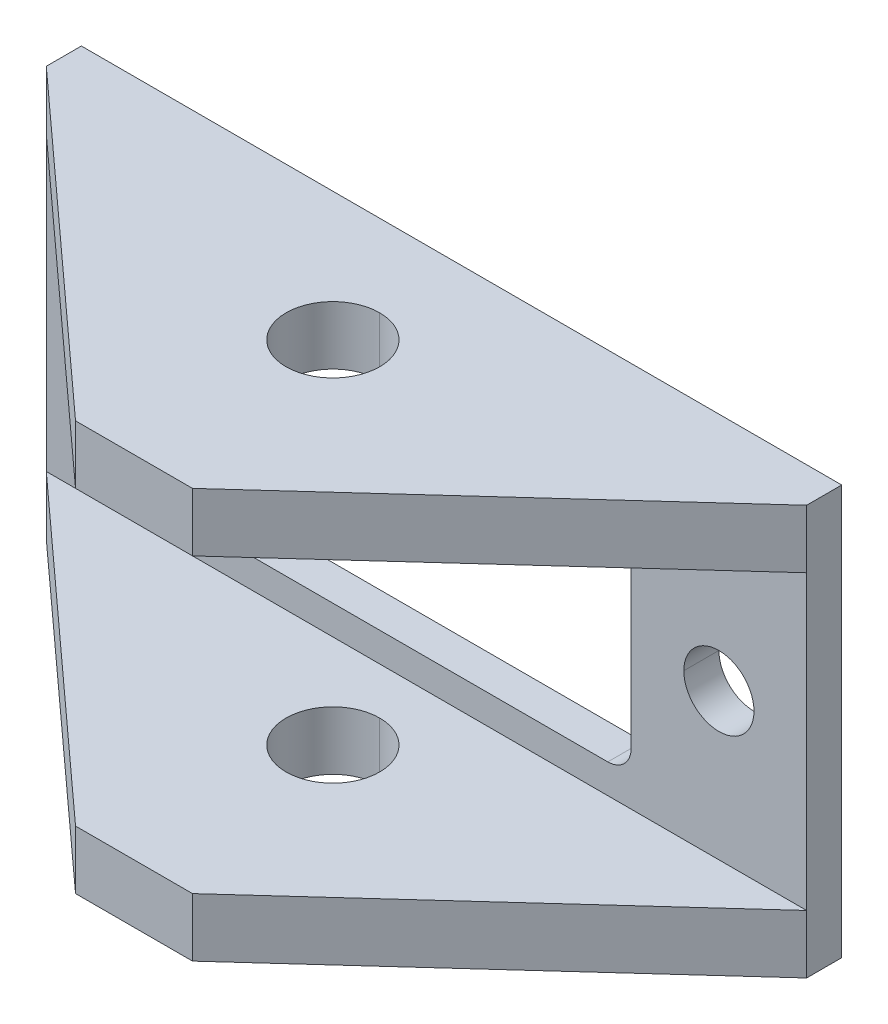
ISO-10303-21;
HEADER;
FILE_DESCRIPTION(('STEP AP214'),'2;1');
FILE_NAME('part.step','',(''),(''),'','','');
FILE_SCHEMA(('AUTOMOTIVE_DESIGN { 1 0 10303 214 1 1 1 1 }'));
ENDSEC;
DATA;
#1=APPLICATION_CONTEXT('core data for automotive mechanical design processes');
#2=APPLICATION_PROTOCOL_DEFINITION('international standard','automotive_design',2000,#1);
#3=PRODUCT_CONTEXT('',#1,'mechanical');
#4=PRODUCT('Part','Part','',(#3));
#5=PRODUCT_RELATED_PRODUCT_CATEGORY('part','',(#4));
#6=PRODUCT_DEFINITION_FORMATION('','',#4);
#7=PRODUCT_DEFINITION_CONTEXT('part definition',#1,'design');
#8=PRODUCT_DEFINITION('design','',#6,#7);
#9=PRODUCT_DEFINITION_SHAPE('','',#8);
#10=(LENGTH_UNIT() NAMED_UNIT(*) SI_UNIT(.MILLI.,.METRE.));
#11=(NAMED_UNIT(*) PLANE_ANGLE_UNIT() SI_UNIT($,.RADIAN.));
#12=(NAMED_UNIT(*) SI_UNIT($,.STERADIAN.) SOLID_ANGLE_UNIT());
#13=UNCERTAINTY_MEASURE_WITH_UNIT(LENGTH_MEASURE(1.E-05),#10,'distance_accuracy_value','');
#14=(GEOMETRIC_REPRESENTATION_CONTEXT(3) GLOBAL_UNCERTAINTY_ASSIGNED_CONTEXT((#13)) GLOBAL_UNIT_ASSIGNED_CONTEXT((#10,
#11,#12)) REPRESENTATION_CONTEXT('',''));
#15=CARTESIAN_POINT('',(0.,0.,0.));
#16=DIRECTION('',(0.,0.,1.));
#17=DIRECTION('',(1.,0.,0.));
#18=AXIS2_PLACEMENT_3D('',#15,#16,#17);
#19=CARTESIAN_POINT('',(0.,0.,-1.5));
#20=DIRECTION('',(0.,1.,0.));
#21=DIRECTION('',(0.,0.,1.));
#22=AXIS2_PLACEMENT_3D('',#19,#20,#21);
#23=CYLINDRICAL_SURFACE('',#22,4.);
#24=DIRECTION('',(0.,1.,0.));
#25=VECTOR('',#24,1.);
#26=CARTESIAN_POINT('',(0.,0.,-5.5));
#27=LINE('',#26,#25);
#28=CARTESIAN_POINT('',(0.,0.,-5.5));
#29=VERTEX_POINT('',#28);
#30=CARTESIAN_POINT('',(0.,5.,-5.5));
#31=VERTEX_POINT('',#30);
#32=EDGE_CURVE('E396',#29,#31,#27,.T.);
#33=ORIENTED_EDGE('',*,*,#32,.F.);
#34=CARTESIAN_POINT('',(0.,0.,-1.5));
#35=DIRECTION('',(0.,1.,0.));
#36=DIRECTION('',(0.,0.,1.));
#37=AXIS2_PLACEMENT_3D('',#34,#35,#36);
#38=CIRCLE('',#37,4.);
#39=CARTESIAN_POINT('',(0.,0.,2.5));
#40=VERTEX_POINT('',#39);
#41=EDGE_CURVE('E353',#40,#29,#38,.T.);
#42=ORIENTED_EDGE('',*,*,#41,.F.);
#43=DIRECTION('',(0.,1.,0.));
#44=VECTOR('',#43,1.);
#45=CARTESIAN_POINT('',(0.,0.,2.5));
#46=LINE('',#45,#44);
#47=CARTESIAN_POINT('',(0.,5.,2.5));
#48=VERTEX_POINT('',#47);
#49=EDGE_CURVE('E280',#40,#48,#46,.T.);
#50=ORIENTED_EDGE('',*,*,#49,.T.);
#51=CARTESIAN_POINT('',(0.,5.,-1.5));
#52=DIRECTION('',(0.,-1.,0.));
#53=DIRECTION('',(0.,0.,-1.));
#54=AXIS2_PLACEMENT_3D('',#51,#52,#53);
#55=CIRCLE('',#54,4.);
#56=EDGE_CURVE('E356',#31,#48,#55,.T.);
#57=ORIENTED_EDGE('',*,*,#56,.F.);
#58=EDGE_LOOP('',(#33,#42,#50,#57));
#59=FACE_BOUND('',#58,.T.);
#60=ADVANCED_FACE('F16',(#59),#23,.F.);
#61=CARTESIAN_POINT('',(0.,0.,-1.5));
#62=DIRECTION('',(0.,1.,0.));
#63=DIRECTION('',(0.,0.,1.));
#64=AXIS2_PLACEMENT_3D('',#61,#62,#63);
#65=CYLINDRICAL_SURFACE('',#64,4.);
#66=DIRECTION('',(0.,1.,0.));
#67=VECTOR('',#66,1.);
#68=CARTESIAN_POINT('',(0.,0.,-5.5));
#69=LINE('',#68,#67);
#70=CARTESIAN_POINT('',(0.,30.,-5.5));
#71=VERTEX_POINT('',#70);
#72=CARTESIAN_POINT('',(0.,35.,-5.5));
#73=VERTEX_POINT('',#72);
#74=EDGE_CURVE('E279',#71,#73,#69,.T.);
#75=ORIENTED_EDGE('',*,*,#74,.F.);
#76=CARTESIAN_POINT('',(0.,30.,-1.5));
#77=DIRECTION('',(0.,-1.,0.));
#78=DIRECTION('',(0.,0.,-1.));
#79=AXIS2_PLACEMENT_3D('',#76,#77,#78);
#80=CIRCLE('',#79,4.);
#81=CARTESIAN_POINT('',(0.,30.,2.5));
#82=VERTEX_POINT('',#81);
#83=EDGE_CURVE('E416',#71,#82,#80,.T.);
#84=ORIENTED_EDGE('',*,*,#83,.T.);
#85=DIRECTION('',(0.,1.,0.));
#86=VECTOR('',#85,1.);
#87=CARTESIAN_POINT('',(0.,0.,2.5));
#88=LINE('',#87,#86);
#89=CARTESIAN_POINT('',(0.,35.,2.5));
#90=VERTEX_POINT('',#89);
#91=EDGE_CURVE('E448',#82,#90,#88,.T.);
#92=ORIENTED_EDGE('',*,*,#91,.T.);
#93=CARTESIAN_POINT('',(0.,35.,-1.5));
#94=DIRECTION('',(0.,1.,0.));
#95=DIRECTION('',(0.,0.,1.));
#96=AXIS2_PLACEMENT_3D('',#93,#94,#95);
#97=CIRCLE('',#96,4.);
#98=EDGE_CURVE('E357',#90,#73,#97,.T.);
#99=ORIENTED_EDGE('',*,*,#98,.T.);
#100=EDGE_LOOP('',(#75,#84,#92,#99));
#101=FACE_BOUND('',#100,.T.);
#102=ADVANCED_FACE('F607',(#101),#65,.F.);
#103=CARTESIAN_POINT('',(15.5,9.5,-12.5));
#104=DIRECTION('',(0.,0.,1.));
#105=DIRECTION('',(1.,0.,0.));
#106=AXIS2_PLACEMENT_3D('',#103,#104,#105);
#107=CYLINDRICAL_SURFACE('',#106,2.);
#108=CARTESIAN_POINT('',(15.5,9.5,-12.5));
#109=DIRECTION('',(0.,0.,1.));
#110=DIRECTION('',(-1.,0.,0.));
#111=AXIS2_PLACEMENT_3D('',#108,#109,#110);
#112=CIRCLE('',#111,2.);
#113=CARTESIAN_POINT('',(15.5,7.5,-12.5));
#114=VERTEX_POINT('',#113);
#115=CARTESIAN_POINT('',(17.5,9.5,-12.5));
#116=VERTEX_POINT('',#115);
#117=EDGE_CURVE('E291',#114,#116,#112,.T.);
#118=ORIENTED_EDGE('',*,*,#117,.F.);
#119=DIRECTION('',(0.,0.,-1.));
#120=VECTOR('',#119,1.);
#121=CARTESIAN_POINT('',(15.5,7.5,-12.5));
#122=LINE('',#121,#120);
#123=CARTESIAN_POINT('',(15.5,7.5,-9.5));
#124=VERTEX_POINT('',#123);
#125=EDGE_CURVE('E391',#124,#114,#122,.T.);
#126=ORIENTED_EDGE('',*,*,#125,.F.);
#127=CARTESIAN_POINT('',(15.5,9.5,-9.5));
#128=DIRECTION('',(0.,0.,-1.));
#129=DIRECTION('',(1.,0.,0.));
#130=AXIS2_PLACEMENT_3D('',#127,#128,#129);
#131=CIRCLE('',#130,2.);
#132=CARTESIAN_POINT('',(17.5,9.5,-9.5));
#133=VERTEX_POINT('',#132);
#134=EDGE_CURVE('E397',#133,#124,#131,.T.);
#135=ORIENTED_EDGE('',*,*,#134,.F.);
#136=DIRECTION('',(0.,0.,1.));
#137=VECTOR('',#136,1.);
#138=CARTESIAN_POINT('',(17.5,9.5,-12.5));
#139=LINE('',#138,#137);
#140=EDGE_CURVE('E198',#116,#133,#139,.T.);
#141=ORIENTED_EDGE('',*,*,#140,.F.);
#142=EDGE_LOOP('',(#118,#126,#135,#141));
#143=FACE_BOUND('',#142,.T.);
#144=ADVANCED_FACE('F685',(#143),#107,.F.);
#145=CARTESIAN_POINT('',(-15.5,9.5,-12.5));
#146=DIRECTION('',(0.,0.,-1.));
#147=DIRECTION('',(-1.,0.,0.));
#148=AXIS2_PLACEMENT_3D('',#145,#146,#147);
#149=CYLINDRICAL_SURFACE('',#148,2.);
#150=CARTESIAN_POINT('',(-15.5,9.5,-12.5));
#151=DIRECTION('',(0.,0.,1.));
#152=DIRECTION('',(-1.,0.,0.));
#153=AXIS2_PLACEMENT_3D('',#150,#151,#152);
#154=CIRCLE('',#153,2.);
#155=CARTESIAN_POINT('',(-17.5,9.5,-12.5));
#156=VERTEX_POINT('',#155);
#157=CARTESIAN_POINT('',(-15.5,7.5,-12.5));
#158=VERTEX_POINT('',#157);
#159=EDGE_CURVE('E292',#156,#158,#154,.T.);
#160=ORIENTED_EDGE('',*,*,#159,.F.);
#161=DIRECTION('',(0.,0.,-1.));
#162=VECTOR('',#161,1.);
#163=CARTESIAN_POINT('',(-17.5,9.5,-12.5));
#164=LINE('',#163,#162);
#165=CARTESIAN_POINT('',(-17.5,9.5,-9.5));
#166=VERTEX_POINT('',#165);
#167=EDGE_CURVE('E427',#166,#156,#164,.T.);
#168=ORIENTED_EDGE('',*,*,#167,.F.);
#169=CARTESIAN_POINT('',(-15.5,9.5,-9.5));
#170=DIRECTION('',(0.,0.,-1.));
#171=DIRECTION('',(1.,0.,0.));
#172=AXIS2_PLACEMENT_3D('',#169,#170,#171);
#173=CIRCLE('',#172,2.);
#174=CARTESIAN_POINT('',(-15.5,7.5,-9.5));
#175=VERTEX_POINT('',#174);
#176=EDGE_CURVE('E244',#175,#166,#173,.T.);
#177=ORIENTED_EDGE('',*,*,#176,.F.);
#178=DIRECTION('',(0.,0.,1.));
#179=VECTOR('',#178,1.);
#180=CARTESIAN_POINT('',(-15.5,7.5,-9.5));
#181=LINE('',#180,#179);
#182=EDGE_CURVE('E382',#158,#175,#181,.T.);
#183=ORIENTED_EDGE('',*,*,#182,.F.);
#184=EDGE_LOOP('',(#160,#168,#177,#183));
#185=FACE_BOUND('',#184,.T.);
#186=ADVANCED_FACE('F679',(#185),#149,.F.);
#187=CARTESIAN_POINT('',(-15.5,25.5,-12.5));
#188=DIRECTION('',(0.,0.,1.));
#189=DIRECTION('',(1.,0.,0.));
#190=AXIS2_PLACEMENT_3D('',#187,#188,#189);
#191=CYLINDRICAL_SURFACE('',#190,2.);
#192=CARTESIAN_POINT('',(-15.5,25.5,-12.5));
#193=DIRECTION('',(0.,0.,1.));
#194=DIRECTION('',(-1.,0.,0.));
#195=AXIS2_PLACEMENT_3D('',#192,#193,#194);
#196=CIRCLE('',#195,2.);
#197=CARTESIAN_POINT('',(-15.5,27.5,-12.5));
#198=VERTEX_POINT('',#197);
#199=CARTESIAN_POINT('',(-17.5,25.5,-12.5));
#200=VERTEX_POINT('',#199);
#201=EDGE_CURVE('E261',#198,#200,#196,.T.);
#202=ORIENTED_EDGE('',*,*,#201,.F.);
#203=DIRECTION('',(0.,0.,-1.));
#204=VECTOR('',#203,1.);
#205=CARTESIAN_POINT('',(-15.5,27.5,-12.5));
#206=LINE('',#205,#204);
#207=CARTESIAN_POINT('',(-15.5,27.5,-9.5));
#208=VERTEX_POINT('',#207);
#209=EDGE_CURVE('E11',#208,#198,#206,.T.);
#210=ORIENTED_EDGE('',*,*,#209,.F.);
#211=CARTESIAN_POINT('',(-15.5,25.5,-9.5));
#212=DIRECTION('',(0.,0.,-1.));
#213=DIRECTION('',(1.,0.,0.));
#214=AXIS2_PLACEMENT_3D('',#211,#212,#213);
#215=CIRCLE('',#214,2.);
#216=CARTESIAN_POINT('',(-17.5,25.5,-9.5));
#217=VERTEX_POINT('',#216);
#218=EDGE_CURVE('E318',#217,#208,#215,.T.);
#219=ORIENTED_EDGE('',*,*,#218,.F.);
#220=DIRECTION('',(0.,0.,1.));
#221=VECTOR('',#220,1.);
#222=CARTESIAN_POINT('',(-17.5,25.5,-12.5));
#223=LINE('',#222,#221);
#224=EDGE_CURVE('E430',#200,#217,#223,.T.);
#225=ORIENTED_EDGE('',*,*,#224,.F.);
#226=EDGE_LOOP('',(#202,#210,#219,#225));
#227=FACE_BOUND('',#226,.T.);
#228=ADVANCED_FACE('F18',(#227),#191,.F.);
#229=CARTESIAN_POINT('',(15.5,25.5,-12.5));
#230=DIRECTION('',(0.,0.,-1.));
#231=DIRECTION('',(-1.,0.,0.));
#232=AXIS2_PLACEMENT_3D('',#229,#230,#231);
#233=CYLINDRICAL_SURFACE('',#232,2.);
#234=CARTESIAN_POINT('',(15.5,25.5,-12.5));
#235=DIRECTION('',(0.,0.,1.));
#236=DIRECTION('',(-1.,0.,0.));
#237=AXIS2_PLACEMENT_3D('',#234,#235,#236);
#238=CIRCLE('',#237,2.);
#239=CARTESIAN_POINT('',(17.5,25.5,-12.5));
#240=VERTEX_POINT('',#239);
#241=CARTESIAN_POINT('',(15.5,27.5,-12.5));
#242=VERTEX_POINT('',#241);
#243=EDGE_CURVE('E262',#240,#242,#238,.T.);
#244=ORIENTED_EDGE('',*,*,#243,.F.);
#245=DIRECTION('',(0.,0.,-1.));
#246=VECTOR('',#245,1.);
#247=CARTESIAN_POINT('',(17.5,25.5,-12.5));
#248=LINE('',#247,#246);
#249=CARTESIAN_POINT('',(17.5,25.5,-9.5));
#250=VERTEX_POINT('',#249);
#251=EDGE_CURVE('E187',#250,#240,#248,.T.);
#252=ORIENTED_EDGE('',*,*,#251,.F.);
#253=CARTESIAN_POINT('',(15.5,25.5,-9.5));
#254=DIRECTION('',(0.,0.,-1.));
#255=DIRECTION('',(1.,0.,0.));
#256=AXIS2_PLACEMENT_3D('',#253,#254,#255);
#257=CIRCLE('',#256,2.);
#258=CARTESIAN_POINT('',(15.5,27.5,-9.5));
#259=VERTEX_POINT('',#258);
#260=EDGE_CURVE('E343',#259,#250,#257,.T.);
#261=ORIENTED_EDGE('',*,*,#260,.F.);
#262=DIRECTION('',(0.,0.,1.));
#263=VECTOR('',#262,1.);
#264=CARTESIAN_POINT('',(15.5,27.5,-9.5));
#265=LINE('',#264,#263);
#266=EDGE_CURVE('E27',#242,#259,#265,.T.);
#267=ORIENTED_EDGE('',*,*,#266,.F.);
#268=EDGE_LOOP('',(#244,#252,#261,#267));
#269=FACE_BOUND('',#268,.T.);
#270=ADVANCED_FACE('F656',(#269),#233,.F.);
#271=CARTESIAN_POINT('',(-25.,17.5,-12.5));
#272=DIRECTION('',(0.,0.,1.));
#273=DIRECTION('',(1.,0.,0.));
#274=AXIS2_PLACEMENT_3D('',#271,#272,#273);
#275=CYLINDRICAL_SURFACE('',#274,3.);
#276=DIRECTION('',(0.,0.,1.));
#277=VECTOR('',#276,1.);
#278=CARTESIAN_POINT('',(-28.,17.5,-12.5));
#279=LINE('',#278,#277);
#280=CARTESIAN_POINT('',(-28.,17.5,-12.5));
#281=VERTEX_POINT('',#280);
#282=CARTESIAN_POINT('',(-28.,17.5,-9.5));
#283=VERTEX_POINT('',#282);
#284=EDGE_CURVE('E263',#281,#283,#279,.T.);
#285=ORIENTED_EDGE('',*,*,#284,.F.);
#286=CARTESIAN_POINT('',(-25.,17.5,-12.5));
#287=DIRECTION('',(0.,0.,1.));
#288=DIRECTION('',(1.,0.,0.));
#289=AXIS2_PLACEMENT_3D('',#286,#287,#288);
#290=CIRCLE('',#289,3.);
#291=CARTESIAN_POINT('',(-22.,17.5,-12.5));
#292=VERTEX_POINT('',#291);
#293=EDGE_CURVE('E300',#292,#281,#290,.T.);
#294=ORIENTED_EDGE('',*,*,#293,.F.);
#295=DIRECTION('',(0.,0.,1.));
#296=VECTOR('',#295,1.);
#297=CARTESIAN_POINT('',(-22.,17.5,-12.5));
#298=LINE('',#297,#296);
#299=CARTESIAN_POINT('',(-22.,17.5,-9.5));
#300=VERTEX_POINT('',#299);
#301=EDGE_CURVE('E297',#292,#300,#298,.T.);
#302=ORIENTED_EDGE('',*,*,#301,.T.);
#303=CARTESIAN_POINT('',(-25.,17.5,-9.5));
#304=DIRECTION('',(0.,0.,1.));
#305=DIRECTION('',(1.,0.,0.));
#306=AXIS2_PLACEMENT_3D('',#303,#304,#305);
#307=CIRCLE('',#306,3.);
#308=EDGE_CURVE('E331',#300,#283,#307,.T.);
#309=ORIENTED_EDGE('',*,*,#308,.T.);
#310=EDGE_LOOP('',(#285,#294,#302,#309));
#311=FACE_BOUND('',#310,.T.);
#312=ADVANCED_FACE('F757',(#311),#275,.F.);
#313=CARTESIAN_POINT('',(25.,17.5,-12.5));
#314=DIRECTION('',(0.,0.,1.));
#315=DIRECTION('',(1.,0.,0.));
#316=AXIS2_PLACEMENT_3D('',#313,#314,#315);
#317=CYLINDRICAL_SURFACE('',#316,3.);
#318=DIRECTION('',(0.,0.,1.));
#319=VECTOR('',#318,1.);
#320=CARTESIAN_POINT('',(22.,17.5,-12.5));
#321=LINE('',#320,#319);
#322=CARTESIAN_POINT('',(22.,17.5,-12.5));
#323=VERTEX_POINT('',#322);
#324=CARTESIAN_POINT('',(22.,17.5,-9.5));
#325=VERTEX_POINT('',#324);
#326=EDGE_CURVE('E274',#323,#325,#321,.T.);
#327=ORIENTED_EDGE('',*,*,#326,.F.);
#328=CARTESIAN_POINT('',(25.,17.5,-12.5));
#329=DIRECTION('',(0.,0.,1.));
#330=DIRECTION('',(1.,0.,0.));
#331=AXIS2_PLACEMENT_3D('',#328,#329,#330);
#332=CIRCLE('',#331,3.);
#333=CARTESIAN_POINT('',(28.,17.5,-12.5));
#334=VERTEX_POINT('',#333);
#335=EDGE_CURVE('E303',#334,#323,#332,.T.);
#336=ORIENTED_EDGE('',*,*,#335,.F.);
#337=DIRECTION('',(0.,0.,1.));
#338=VECTOR('',#337,1.);
#339=CARTESIAN_POINT('',(28.,17.5,-12.5));
#340=LINE('',#339,#338);
#341=CARTESIAN_POINT('',(28.,17.5,-9.5));
#342=VERTEX_POINT('',#341);
#343=EDGE_CURVE('E273',#334,#342,#340,.T.);
#344=ORIENTED_EDGE('',*,*,#343,.T.);
#345=CARTESIAN_POINT('',(25.,17.5,-9.5));
#346=DIRECTION('',(0.,0.,1.));
#347=DIRECTION('',(1.,0.,0.));
#348=AXIS2_PLACEMENT_3D('',#345,#346,#347);
#349=CIRCLE('',#348,3.);
#350=EDGE_CURVE('E20',#342,#325,#349,.T.);
#351=ORIENTED_EDGE('',*,*,#350,.T.);
#352=EDGE_LOOP('',(#327,#336,#344,#351));
#353=FACE_BOUND('',#352,.T.);
#354=ADVANCED_FACE('F713',(#353),#317,.F.);
#355=CARTESIAN_POINT('',(0.,27.5,-12.5));
#356=DIRECTION('',(0.,-1.,0.));
#357=DIRECTION('',(0.,0.,-1.));
#358=AXIS2_PLACEMENT_3D('',#355,#356,#357);
#359=PLANE('',#358);
#360=DIRECTION('',(1.,0.,0.));
#361=VECTOR('',#360,1.);
#362=CARTESIAN_POINT('',(0.,27.5,-12.5));
#363=LINE('',#362,#361);
#364=EDGE_CURVE('E258',#198,#242,#363,.T.);
#365=ORIENTED_EDGE('',*,*,#364,.T.);
#366=ORIENTED_EDGE('',*,*,#266,.T.);
#367=DIRECTION('',(1.,0.,0.));
#368=VECTOR('',#367,1.);
#369=CARTESIAN_POINT('',(0.,27.5,-9.5));
#370=LINE('',#369,#368);
#371=EDGE_CURVE('E348',#208,#259,#370,.T.);
#372=ORIENTED_EDGE('',*,*,#371,.F.);
#373=ORIENTED_EDGE('',*,*,#209,.T.);
#374=EDGE_LOOP('',(#365,#366,#372,#373));
#375=FACE_BOUND('',#374,.T.);
#376=ADVANCED_FACE('F661',(#375),#359,.T.);
#377=CARTESIAN_POINT('',(-17.5,0.,-12.5));
#378=DIRECTION('',(-1.,0.,0.));
#379=DIRECTION('',(0.,1.,0.));
#380=AXIS2_PLACEMENT_3D('',#377,#378,#379);
#381=PLANE('',#380);
#382=DIRECTION('',(0.,-1.,0.));
#383=VECTOR('',#382,1.);
#384=CARTESIAN_POINT('',(-17.5,0.,-12.5));
#385=LINE('',#384,#383);
#386=EDGE_CURVE('E327',#200,#156,#385,.T.);
#387=ORIENTED_EDGE('',*,*,#386,.F.);
#388=ORIENTED_EDGE('',*,*,#224,.T.);
#389=DIRECTION('',(0.,-1.,0.));
#390=VECTOR('',#389,1.);
#391=CARTESIAN_POINT('',(-17.5,0.,-9.5));
#392=LINE('',#391,#390);
#393=EDGE_CURVE('E314',#217,#166,#392,.T.);
#394=ORIENTED_EDGE('',*,*,#393,.T.);
#395=ORIENTED_EDGE('',*,*,#167,.T.);
#396=EDGE_LOOP('',(#387,#388,#394,#395));
#397=FACE_BOUND('',#396,.T.);
#398=ADVANCED_FACE('F675',(#397),#381,.F.);
#399=CARTESIAN_POINT('',(0.,7.5,-12.5));
#400=DIRECTION('',(0.,-1.,0.));
#401=DIRECTION('',(0.,0.,-1.));
#402=AXIS2_PLACEMENT_3D('',#399,#400,#401);
#403=PLANE('',#402);
#404=DIRECTION('',(1.,0.,0.));
#405=VECTOR('',#404,1.);
#406=CARTESIAN_POINT('',(0.,7.5,-12.5));
#407=LINE('',#406,#405);
#408=EDGE_CURVE('E287',#158,#114,#407,.T.);
#409=ORIENTED_EDGE('',*,*,#408,.F.);
#410=ORIENTED_EDGE('',*,*,#182,.T.);
#411=DIRECTION('',(1.,0.,0.));
#412=VECTOR('',#411,1.);
#413=CARTESIAN_POINT('',(0.,7.5,-9.5));
#414=LINE('',#413,#412);
#415=EDGE_CURVE('E252',#175,#124,#414,.T.);
#416=ORIENTED_EDGE('',*,*,#415,.T.);
#417=ORIENTED_EDGE('',*,*,#125,.T.);
#418=EDGE_LOOP('',(#409,#410,#416,#417));
#419=FACE_BOUND('',#418,.T.);
#420=ADVANCED_FACE('F682',(#419),#403,.F.);
#421=CARTESIAN_POINT('',(17.5,0.,-12.5));
#422=DIRECTION('',(-1.,0.,0.));
#423=DIRECTION('',(0.,1.,0.));
#424=AXIS2_PLACEMENT_3D('',#421,#422,#423);
#425=PLANE('',#424);
#426=DIRECTION('',(0.,-1.,0.));
#427=VECTOR('',#426,1.);
#428=CARTESIAN_POINT('',(17.5,0.,-9.5));
#429=LINE('',#428,#427);
#430=EDGE_CURVE('E347',#250,#133,#429,.T.);
#431=ORIENTED_EDGE('',*,*,#430,.F.);
#432=ORIENTED_EDGE('',*,*,#251,.T.);
#433=DIRECTION('',(0.,-1.,0.));
#434=VECTOR('',#433,1.);
#435=CARTESIAN_POINT('',(17.5,0.,-12.5));
#436=LINE('',#435,#434);
#437=EDGE_CURVE('E342',#240,#116,#436,.T.);
#438=ORIENTED_EDGE('',*,*,#437,.T.);
#439=ORIENTED_EDGE('',*,*,#140,.T.);
#440=EDGE_LOOP('',(#431,#432,#438,#439));
#441=FACE_BOUND('',#440,.T.);
#442=ADVANCED_FACE('F667',(#441),#425,.T.);
#443=CARTESIAN_POINT('',(0.,30.,-9.5));
#444=DIRECTION('',(0.,-1.,0.));
#445=DIRECTION('',(0.,0.,-1.));
#446=AXIS2_PLACEMENT_3D('',#443,#444,#445);
#447=PLANE('',#446);
#448=CARTESIAN_POINT('',(0.,30.,-1.5));
#449=DIRECTION('',(0.,-1.,0.));
#450=DIRECTION('',(0.,0.,-1.));
#451=AXIS2_PLACEMENT_3D('',#448,#449,#450);
#452=CIRCLE('',#451,4.);
#453=EDGE_CURVE('E275',#82,#71,#452,.T.);
#454=ORIENTED_EDGE('',*,*,#453,.F.);
#455=ORIENTED_EDGE('',*,*,#83,.F.);
#456=EDGE_LOOP('',(#454,#455));
#457=FACE_BOUND('',#456,.T.);
#458=DIRECTION('',(-0.739940073395944,0.,-0.672672793996312));
#459=VECTOR('',#458,1.);
#460=CARTESIAN_POINT('',(-9.97737556561086,30.,10.9751131221719));
#461=LINE('',#460,#459);
#462=CARTESIAN_POINT('',(-5.,30.,15.5));
#463=VERTEX_POINT('',#462);
#464=CARTESIAN_POINT('',(-32.5,30.,-9.5));
#465=VERTEX_POINT('',#464);
#466=EDGE_CURVE('E218',#463,#465,#461,.T.);
#467=ORIENTED_EDGE('',*,*,#466,.T.);
#468=DIRECTION('',(1.,0.,0.));
#469=VECTOR('',#468,1.);
#470=CARTESIAN_POINT('',(0.,30.,-9.5));
#471=LINE('',#470,#469);
#472=CARTESIAN_POINT('',(32.5,30.,-9.5));
#473=VERTEX_POINT('',#472);
#474=EDGE_CURVE('E420',#465,#473,#471,.T.);
#475=ORIENTED_EDGE('',*,*,#474,.T.);
#476=DIRECTION('',(-0.739940073395944,0.,0.672672793996312));
#477=VECTOR('',#476,1.);
#478=CARTESIAN_POINT('',(9.97737556561086,30.,10.9751131221719));
#479=LINE('',#478,#477);
#480=CARTESIAN_POINT('',(5.,30.,15.5));
#481=VERTEX_POINT('',#480);
#482=EDGE_CURVE('E221',#473,#481,#479,.T.);
#483=ORIENTED_EDGE('',*,*,#482,.T.);
#484=DIRECTION('',(-1.,0.,0.));
#485=VECTOR('',#484,1.);
#486=CARTESIAN_POINT('',(0.,30.,15.5));
#487=LINE('',#486,#485);
#488=EDGE_CURVE('E212',#481,#463,#487,.T.);
#489=ORIENTED_EDGE('',*,*,#488,.T.);
#490=EDGE_LOOP('',(#467,#475,#483,#489));
#491=FACE_BOUND('',#490,.T.);
#492=ADVANCED_FACE('F214',(#457,#491),#447,.T.);
#493=CARTESIAN_POINT('',(0.,5.,-9.5));
#494=DIRECTION('',(0.,-1.,0.));
#495=DIRECTION('',(0.,0.,-1.));
#496=AXIS2_PLACEMENT_3D('',#493,#494,#495);
#497=PLANE('',#496);
#498=CARTESIAN_POINT('',(0.,5.,-1.5));
#499=DIRECTION('',(0.,-1.,0.));
#500=DIRECTION('',(0.,0.,-1.));
#501=AXIS2_PLACEMENT_3D('',#498,#499,#500);
#502=CIRCLE('',#501,4.);
#503=EDGE_CURVE('E401',#48,#31,#502,.T.);
#504=ORIENTED_EDGE('',*,*,#503,.T.);
#505=ORIENTED_EDGE('',*,*,#56,.T.);
#506=EDGE_LOOP('',(#504,#505));
#507=FACE_BOUND('',#506,.T.);
#508=DIRECTION('',(-1.,0.,0.));
#509=VECTOR('',#508,1.);
#510=CARTESIAN_POINT('',(0.,5.,15.5));
#511=LINE('',#510,#509);
#512=CARTESIAN_POINT('',(5.,5.,15.5));
#513=VERTEX_POINT('',#512);
#514=CARTESIAN_POINT('',(-5.,5.,15.5));
#515=VERTEX_POINT('',#514);
#516=EDGE_CURVE('E362',#513,#515,#511,.T.);
#517=ORIENTED_EDGE('',*,*,#516,.F.);
#518=DIRECTION('',(-0.739940073395944,0.,0.672672793996312));
#519=VECTOR('',#518,1.);
#520=CARTESIAN_POINT('',(9.97737556561086,5.,10.9751131221719));
#521=LINE('',#520,#519);
#522=CARTESIAN_POINT('',(32.5,5.,-9.5));
#523=VERTEX_POINT('',#522);
#524=EDGE_CURVE('E387',#523,#513,#521,.T.);
#525=ORIENTED_EDGE('',*,*,#524,.F.);
#526=DIRECTION('',(1.,0.,0.));
#527=VECTOR('',#526,1.);
#528=CARTESIAN_POINT('',(0.,5.,-9.5));
#529=LINE('',#528,#527);
#530=CARTESIAN_POINT('',(-32.5,5.,-9.5));
#531=VERTEX_POINT('',#530);
#532=EDGE_CURVE('E335',#531,#523,#529,.T.);
#533=ORIENTED_EDGE('',*,*,#532,.F.);
#534=DIRECTION('',(-0.739940073395944,0.,-0.672672793996312));
#535=VECTOR('',#534,1.);
#536=CARTESIAN_POINT('',(-9.97737556561086,5.,10.9751131221719));
#537=LINE('',#536,#535);
#538=EDGE_CURVE('E324',#515,#531,#537,.T.);
#539=ORIENTED_EDGE('',*,*,#538,.F.);
#540=EDGE_LOOP('',(#517,#525,#533,#539));
#541=FACE_BOUND('',#540,.T.);
#542=ADVANCED_FACE('F494',(#507,#541),#497,.F.);
#543=CARTESIAN_POINT('',(0.,0.,0.));
#544=DIRECTION('',(0.,1.,0.));
#545=DIRECTION('',(1.,0.,0.));
#546=AXIS2_PLACEMENT_3D('',#543,#544,#545);
#547=PLANE('',#546);
#548=ORIENTED_EDGE('',*,*,#41,.T.);
#549=CARTESIAN_POINT('',(0.,0.,-1.5));
#550=DIRECTION('',(0.,1.,0.));
#551=DIRECTION('',(0.,0.,1.));
#552=AXIS2_PLACEMENT_3D('',#549,#550,#551);
#553=CIRCLE('',#552,4.);
#554=EDGE_CURVE('E392',#29,#40,#553,.T.);
#555=ORIENTED_EDGE('',*,*,#554,.T.);
#556=EDGE_LOOP('',(#548,#555));
#557=FACE_BOUND('',#556,.T.);
#558=DIRECTION('',(0.739940073395944,0.,0.672672793996312));
#559=VECTOR('',#558,1.);
#560=CARTESIAN_POINT('',(-9.97737556561086,0.,10.9751131221719));
#561=LINE('',#560,#559);
#562=CARTESIAN_POINT('',(-32.5,0.,-9.5));
#563=VERTEX_POINT('',#562);
#564=CARTESIAN_POINT('',(-5.,0.,15.5));
#565=VERTEX_POINT('',#564);
#566=EDGE_CURVE('E323',#563,#565,#561,.T.);
#567=ORIENTED_EDGE('',*,*,#566,.F.);
#568=DIRECTION('',(0.,0.,1.));
#569=VECTOR('',#568,1.);
#570=CARTESIAN_POINT('',(-32.5,0.,0.));
#571=LINE('',#570,#569);
#572=CARTESIAN_POINT('',(-32.5,0.,-12.5));
#573=VERTEX_POINT('',#572);
#574=EDGE_CURVE('E439',#573,#563,#571,.T.);
#575=ORIENTED_EDGE('',*,*,#574,.F.);
#576=DIRECTION('',(1.,0.,0.));
#577=VECTOR('',#576,1.);
#578=CARTESIAN_POINT('',(0.,0.,-12.5));
#579=LINE('',#578,#577);
#580=CARTESIAN_POINT('',(32.5,0.,-12.5));
#581=VERTEX_POINT('',#580);
#582=EDGE_CURVE('E286',#573,#581,#579,.T.);
#583=ORIENTED_EDGE('',*,*,#582,.T.);
#584=DIRECTION('',(0.,0.,1.));
#585=VECTOR('',#584,1.);
#586=CARTESIAN_POINT('',(32.5,0.,-1.50342701251323E-13));
#587=LINE('',#586,#585);
#588=CARTESIAN_POINT('',(32.5,0.,-9.5));
#589=VERTEX_POINT('',#588);
#590=EDGE_CURVE('E42',#581,#589,#587,.T.);
#591=ORIENTED_EDGE('',*,*,#590,.T.);
#592=DIRECTION('',(0.739940073395944,0.,-0.672672793996312));
#593=VECTOR('',#592,1.);
#594=CARTESIAN_POINT('',(9.97737556561086,0.,10.9751131221719));
#595=LINE('',#594,#593);
#596=CARTESIAN_POINT('',(5.,0.,15.5));
#597=VERTEX_POINT('',#596);
#598=EDGE_CURVE('E376',#597,#589,#595,.T.);
#599=ORIENTED_EDGE('',*,*,#598,.F.);
#600=DIRECTION('',(1.,0.,0.));
#601=VECTOR('',#600,1.);
#602=CARTESIAN_POINT('',(0.,0.,15.5));
#603=LINE('',#602,#601);
#604=EDGE_CURVE('E388',#565,#597,#603,.T.);
#605=ORIENTED_EDGE('',*,*,#604,.F.);
#606=EDGE_LOOP('',(#567,#575,#583,#591,#599,#605));
#607=FACE_BOUND('',#606,.T.);
#608=ADVANCED_FACE('F479',(#557,#607),#547,.F.);
#609=CARTESIAN_POINT('',(0.,35.,0.));
#610=DIRECTION('',(0.,1.,0.));
#611=DIRECTION('',(1.,0.,0.));
#612=AXIS2_PLACEMENT_3D('',#609,#610,#611);
#613=PLANE('',#612);
#614=ORIENTED_EDGE('',*,*,#98,.F.);
#615=CARTESIAN_POINT('',(0.,35.,-1.5));
#616=DIRECTION('',(0.,1.,0.));
#617=DIRECTION('',(0.,0.,1.));
#618=AXIS2_PLACEMENT_3D('',#615,#616,#617);
#619=CIRCLE('',#618,4.);
#620=EDGE_CURVE('E366',#73,#90,#619,.T.);
#621=ORIENTED_EDGE('',*,*,#620,.F.);
#622=EDGE_LOOP('',(#614,#621));
#623=FACE_BOUND('',#622,.T.);
#624=DIRECTION('',(0.739940073395944,0.,0.672672793996312));
#625=VECTOR('',#624,1.);
#626=CARTESIAN_POINT('',(-9.97737556561086,35.,10.9751131221719));
#627=LINE('',#626,#625);
#628=CARTESIAN_POINT('',(-32.5,35.,-9.5));
#629=VERTEX_POINT('',#628);
#630=CARTESIAN_POINT('',(-5.,35.,15.5));
#631=VERTEX_POINT('',#630);
#632=EDGE_CURVE('E238',#629,#631,#627,.T.);
#633=ORIENTED_EDGE('',*,*,#632,.T.);
#634=DIRECTION('',(1.,0.,0.));
#635=VECTOR('',#634,1.);
#636=CARTESIAN_POINT('',(0.,35.,15.5));
#637=LINE('',#636,#635);
#638=CARTESIAN_POINT('',(5.,35.,15.5));
#639=VERTEX_POINT('',#638);
#640=EDGE_CURVE('E233',#631,#639,#637,.T.);
#641=ORIENTED_EDGE('',*,*,#640,.T.);
#642=DIRECTION('',(0.739940073395944,0.,-0.672672793996312));
#643=VECTOR('',#642,1.);
#644=CARTESIAN_POINT('',(9.97737556561086,35.,10.9751131221719));
#645=LINE('',#644,#643);
#646=CARTESIAN_POINT('',(32.5,35.,-9.5));
#647=VERTEX_POINT('',#646);
#648=EDGE_CURVE('E308',#639,#647,#645,.T.);
#649=ORIENTED_EDGE('',*,*,#648,.T.);
#650=DIRECTION('',(0.,0.,1.));
#651=VECTOR('',#650,1.);
#652=CARTESIAN_POINT('',(32.5,35.,-1.50342701251323E-13));
#653=LINE('',#652,#651);
#654=CARTESIAN_POINT('',(32.5,35.,-12.5));
#655=VERTEX_POINT('',#654);
#656=EDGE_CURVE('E375',#655,#647,#653,.T.);
#657=ORIENTED_EDGE('',*,*,#656,.F.);
#658=DIRECTION('',(1.,0.,0.));
#659=VECTOR('',#658,1.);
#660=CARTESIAN_POINT('',(0.,35.,-12.5));
#661=LINE('',#660,#659);
#662=CARTESIAN_POINT('',(-32.5,35.,-12.5));
#663=VERTEX_POINT('',#662);
#664=EDGE_CURVE('E285',#663,#655,#661,.T.);
#665=ORIENTED_EDGE('',*,*,#664,.F.);
#666=DIRECTION('',(0.,0.,1.));
#667=VECTOR('',#666,1.);
#668=CARTESIAN_POINT('',(-32.5,35.,0.));
#669=LINE('',#668,#667);
#670=EDGE_CURVE('E436',#663,#629,#669,.T.);
#671=ORIENTED_EDGE('',*,*,#670,.T.);
#672=EDGE_LOOP('',(#633,#641,#649,#657,#665,#671));
#673=FACE_BOUND('',#672,.T.);
#674=ADVANCED_FACE('F613',(#623,#673),#613,.T.);
#675=CARTESIAN_POINT('',(-32.5,35.,0.));
#676=DIRECTION('',(1.,0.,0.));
#677=DIRECTION('',(0.,1.,0.));
#678=AXIS2_PLACEMENT_3D('',#675,#676,#677);
#679=PLANE('',#678);
#680=ORIENTED_EDGE('',*,*,#574,.T.);
#681=DIRECTION('',(0.,-1.,0.));
#682=VECTOR('',#681,1.);
#683=CARTESIAN_POINT('',(-32.5,35.,-9.5));
#684=LINE('',#683,#682);
#685=EDGE_CURVE('E319',#531,#563,#684,.T.);
#686=ORIENTED_EDGE('',*,*,#685,.F.);
#687=DIRECTION('',(0.,-1.,0.));
#688=VECTOR('',#687,1.);
#689=CARTESIAN_POINT('',(-32.5,0.,-9.5));
#690=LINE('',#689,#688);
#691=EDGE_CURVE('E256',#465,#531,#690,.T.);
#692=ORIENTED_EDGE('',*,*,#691,.F.);
#693=DIRECTION('',(0.,-1.,0.));
#694=VECTOR('',#693,1.);
#695=CARTESIAN_POINT('',(-32.5,35.,-9.5));
#696=LINE('',#695,#694);
#697=EDGE_CURVE('E227',#629,#465,#696,.T.);
#698=ORIENTED_EDGE('',*,*,#697,.F.);
#699=ORIENTED_EDGE('',*,*,#670,.F.);
#700=DIRECTION('',(0.,-1.,0.));
#701=VECTOR('',#700,1.);
#702=CARTESIAN_POINT('',(-32.5,35.,-12.5));
#703=LINE('',#702,#701);
#704=EDGE_CURVE('E281',#663,#573,#703,.T.);
#705=ORIENTED_EDGE('',*,*,#704,.T.);
#706=EDGE_LOOP('',(#680,#686,#692,#698,#699,#705));
#707=FACE_BOUND('',#706,.T.);
#708=ADVANCED_FACE('F474',(#707),#679,.F.);
#709=CARTESIAN_POINT('',(32.5,35.,-1.50342701251323E-13));
#710=DIRECTION('',(1.,0.,0.));
#711=DIRECTION('',(0.,0.,-1.));
#712=AXIS2_PLACEMENT_3D('',#709,#710,#711);
#713=PLANE('',#712);
#714=ORIENTED_EDGE('',*,*,#590,.F.);
#715=DIRECTION('',(0.,-1.,0.));
#716=VECTOR('',#715,1.);
#717=CARTESIAN_POINT('',(32.5,35.,-12.5));
#718=LINE('',#717,#716);
#719=EDGE_CURVE('E304',#655,#581,#718,.T.);
#720=ORIENTED_EDGE('',*,*,#719,.F.);
#721=ORIENTED_EDGE('',*,*,#656,.T.);
#722=DIRECTION('',(0.,-1.,0.));
#723=VECTOR('',#722,1.);
#724=CARTESIAN_POINT('',(32.5,35.,-9.5));
#725=LINE('',#724,#723);
#726=EDGE_CURVE('E313',#647,#473,#725,.T.);
#727=ORIENTED_EDGE('',*,*,#726,.T.);
#728=DIRECTION('',(0.,-1.,0.));
#729=VECTOR('',#728,1.);
#730=CARTESIAN_POINT('',(32.5,0.,-9.5));
#731=LINE('',#730,#729);
#732=EDGE_CURVE('E417',#473,#523,#731,.T.);
#733=ORIENTED_EDGE('',*,*,#732,.T.);
#734=DIRECTION('',(0.,-1.,0.));
#735=VECTOR('',#734,1.);
#736=CARTESIAN_POINT('',(32.5,35.,-9.5));
#737=LINE('',#736,#735);
#738=EDGE_CURVE('E383',#523,#589,#737,.T.);
#739=ORIENTED_EDGE('',*,*,#738,.T.);
#740=EDGE_LOOP('',(#714,#720,#721,#727,#733,#739));
#741=FACE_BOUND('',#740,.T.);
#742=ADVANCED_FACE('F739',(#741),#713,.T.);
#743=CARTESIAN_POINT('',(9.97737556561086,35.,10.9751131221719));
#744=DIRECTION('',(-0.672672793996312,0.,-0.739940073395944));
#745=DIRECTION('',(-0.739940073395944,0.,0.672672793996312));
#746=AXIS2_PLACEMENT_3D('',#743,#744,#745);
#747=PLANE('',#746);
#748=ORIENTED_EDGE('',*,*,#738,.F.);
#749=ORIENTED_EDGE('',*,*,#524,.T.);
#750=DIRECTION('',(0.,-1.,0.));
#751=VECTOR('',#750,1.);
#752=CARTESIAN_POINT('',(5.,35.,15.5));
#753=LINE('',#752,#751);
#754=EDGE_CURVE('E358',#513,#597,#753,.T.);
#755=ORIENTED_EDGE('',*,*,#754,.T.);
#756=ORIENTED_EDGE('',*,*,#598,.T.);
#757=EDGE_LOOP('',(#748,#749,#755,#756));
#758=FACE_BOUND('',#757,.T.);
#759=ADVANCED_FACE('F735',(#758),#747,.F.);
#760=CARTESIAN_POINT('',(0.,35.,15.5));
#761=DIRECTION('',(0.,0.,-1.));
#762=DIRECTION('',(-1.,0.,0.));
#763=AXIS2_PLACEMENT_3D('',#760,#761,#762);
#764=PLANE('',#763);
#765=ORIENTED_EDGE('',*,*,#754,.F.);
#766=ORIENTED_EDGE('',*,*,#516,.T.);
#767=DIRECTION('',(0.,-1.,0.));
#768=VECTOR('',#767,1.);
#769=CARTESIAN_POINT('',(-5.,35.,15.5));
#770=LINE('',#769,#768);
#771=EDGE_CURVE('E312',#515,#565,#770,.T.);
#772=ORIENTED_EDGE('',*,*,#771,.T.);
#773=ORIENTED_EDGE('',*,*,#604,.T.);
#774=EDGE_LOOP('',(#765,#766,#772,#773));
#775=FACE_BOUND('',#774,.T.);
#776=ADVANCED_FACE('F738',(#775),#764,.F.);
#777=CARTESIAN_POINT('',(-9.97737556561086,35.,10.9751131221719));
#778=DIRECTION('',(0.672672793996312,0.,-0.739940073395944));
#779=DIRECTION('',(0.,-1.,0.));
#780=AXIS2_PLACEMENT_3D('',#777,#778,#779);
#781=PLANE('',#780);
#782=ORIENTED_EDGE('',*,*,#771,.F.);
#783=ORIENTED_EDGE('',*,*,#538,.T.);
#784=ORIENTED_EDGE('',*,*,#685,.T.);
#785=ORIENTED_EDGE('',*,*,#566,.T.);
#786=EDGE_LOOP('',(#782,#783,#784,#785));
#787=FACE_BOUND('',#786,.T.);
#788=ADVANCED_FACE('F485',(#787),#781,.F.);
#789=CARTESIAN_POINT('',(9.97737556561086,35.,10.9751131221719));
#790=DIRECTION('',(-0.672672793996312,0.,-0.739940073395944));
#791=DIRECTION('',(-0.739940073395944,0.,0.672672793996312));
#792=AXIS2_PLACEMENT_3D('',#789,#790,#791);
#793=PLANE('',#792);
#794=ORIENTED_EDGE('',*,*,#482,.F.);
#795=ORIENTED_EDGE('',*,*,#726,.F.);
#796=ORIENTED_EDGE('',*,*,#648,.F.);
#797=DIRECTION('',(0.,-1.,0.));
#798=VECTOR('',#797,1.);
#799=CARTESIAN_POINT('',(5.,35.,15.5));
#800=LINE('',#799,#798);
#801=EDGE_CURVE('E226',#639,#481,#800,.T.);
#802=ORIENTED_EDGE('',*,*,#801,.T.);
#803=EDGE_LOOP('',(#794,#795,#796,#802));
#804=FACE_BOUND('',#803,.T.);
#805=ADVANCED_FACE('F724',(#804),#793,.F.);
#806=CARTESIAN_POINT('',(0.,35.,15.5));
#807=DIRECTION('',(0.,0.,-1.));
#808=DIRECTION('',(-1.,0.,0.));
#809=AXIS2_PLACEMENT_3D('',#806,#807,#808);
#810=PLANE('',#809);
#811=ORIENTED_EDGE('',*,*,#488,.F.);
#812=ORIENTED_EDGE('',*,*,#801,.F.);
#813=ORIENTED_EDGE('',*,*,#640,.F.);
#814=DIRECTION('',(0.,-1.,0.));
#815=VECTOR('',#814,1.);
#816=CARTESIAN_POINT('',(-5.,35.,15.5));
#817=LINE('',#816,#815);
#818=EDGE_CURVE('E230',#631,#463,#817,.T.);
#819=ORIENTED_EDGE('',*,*,#818,.T.);
#820=EDGE_LOOP('',(#811,#812,#813,#819));
#821=FACE_BOUND('',#820,.T.);
#822=ADVANCED_FACE('F231',(#821),#810,.F.);
#823=CARTESIAN_POINT('',(-9.97737556561086,35.,10.9751131221719));
#824=DIRECTION('',(0.672672793996312,0.,-0.739940073395944));
#825=DIRECTION('',(0.,-1.,0.));
#826=AXIS2_PLACEMENT_3D('',#823,#824,#825);
#827=PLANE('',#826);
#828=ORIENTED_EDGE('',*,*,#466,.F.);
#829=ORIENTED_EDGE('',*,*,#818,.F.);
#830=ORIENTED_EDGE('',*,*,#632,.F.);
#831=ORIENTED_EDGE('',*,*,#697,.T.);
#832=EDGE_LOOP('',(#828,#829,#830,#831));
#833=FACE_BOUND('',#832,.T.);
#834=ADVANCED_FACE('F241',(#833),#827,.F.);
#835=CARTESIAN_POINT('',(0.,0.,-9.5));
#836=DIRECTION('',(0.,0.,1.));
#837=DIRECTION('',(1.,0.,0.));
#838=AXIS2_PLACEMENT_3D('',#835,#836,#837);
#839=PLANE('',#838);
#840=ORIENTED_EDGE('',*,*,#393,.F.);
#841=ORIENTED_EDGE('',*,*,#218,.T.);
#842=ORIENTED_EDGE('',*,*,#371,.T.);
#843=ORIENTED_EDGE('',*,*,#260,.T.);
#844=ORIENTED_EDGE('',*,*,#430,.T.);
#845=ORIENTED_EDGE('',*,*,#134,.T.);
#846=ORIENTED_EDGE('',*,*,#415,.F.);
#847=ORIENTED_EDGE('',*,*,#176,.T.);
#848=EDGE_LOOP('',(#840,#841,#842,#843,#844,#845,#846,#847));
#849=FACE_BOUND('',#848,.T.);
#850=ORIENTED_EDGE('',*,*,#350,.F.);
#851=CARTESIAN_POINT('',(25.,17.5,-9.5));
#852=DIRECTION('',(0.,0.,1.));
#853=DIRECTION('',(1.,0.,0.));
#854=AXIS2_PLACEMENT_3D('',#851,#852,#853);
#855=CIRCLE('',#854,3.);
#856=EDGE_CURVE('E269',#325,#342,#855,.T.);
#857=ORIENTED_EDGE('',*,*,#856,.F.);
#858=EDGE_LOOP('',(#850,#857));
#859=FACE_BOUND('',#858,.T.);
#860=ORIENTED_EDGE('',*,*,#308,.F.);
#861=CARTESIAN_POINT('',(-25.,17.5,-9.5));
#862=DIRECTION('',(0.,0.,1.));
#863=DIRECTION('',(1.,0.,0.));
#864=AXIS2_PLACEMENT_3D('',#861,#862,#863);
#865=CIRCLE('',#864,3.);
#866=EDGE_CURVE('E267',#283,#300,#865,.T.);
#867=ORIENTED_EDGE('',*,*,#866,.F.);
#868=EDGE_LOOP('',(#860,#867));
#869=FACE_BOUND('',#868,.T.);
#870=ORIENTED_EDGE('',*,*,#732,.F.);
#871=ORIENTED_EDGE('',*,*,#474,.F.);
#872=ORIENTED_EDGE('',*,*,#691,.T.);
#873=ORIENTED_EDGE('',*,*,#532,.T.);
#874=EDGE_LOOP('',(#870,#871,#872,#873));
#875=FACE_BOUND('',#874,.T.);
#876=ADVANCED_FACE('F499',(#849,#859,#869,#875),#839,.T.);
#877=CARTESIAN_POINT('',(0.,35.,-12.5));
#878=DIRECTION('',(0.,0.,-1.));
#879=DIRECTION('',(0.,-1.,0.));
#880=AXIS2_PLACEMENT_3D('',#877,#878,#879);
#881=PLANE('',#880);
#882=ORIENTED_EDGE('',*,*,#386,.T.);
#883=ORIENTED_EDGE('',*,*,#159,.T.);
#884=ORIENTED_EDGE('',*,*,#408,.T.);
#885=ORIENTED_EDGE('',*,*,#117,.T.);
#886=ORIENTED_EDGE('',*,*,#437,.F.);
#887=ORIENTED_EDGE('',*,*,#243,.T.);
#888=ORIENTED_EDGE('',*,*,#364,.F.);
#889=ORIENTED_EDGE('',*,*,#201,.T.);
#890=EDGE_LOOP('',(#882,#883,#884,#885,#886,#887,#888,#889));
#891=FACE_BOUND('',#890,.T.);
#892=ORIENTED_EDGE('',*,*,#335,.T.);
#893=CARTESIAN_POINT('',(25.,17.5,-12.5));
#894=DIRECTION('',(0.,0.,1.));
#895=DIRECTION('',(1.,0.,0.));
#896=AXIS2_PLACEMENT_3D('',#893,#894,#895);
#897=CIRCLE('',#896,3.);
#898=EDGE_CURVE('E293',#323,#334,#897,.T.);
#899=ORIENTED_EDGE('',*,*,#898,.T.);
#900=EDGE_LOOP('',(#892,#899));
#901=FACE_BOUND('',#900,.T.);
#902=ORIENTED_EDGE('',*,*,#293,.T.);
#903=CARTESIAN_POINT('',(-25.,17.5,-12.5));
#904=DIRECTION('',(0.,0.,1.));
#905=DIRECTION('',(1.,0.,0.));
#906=AXIS2_PLACEMENT_3D('',#903,#904,#905);
#907=CIRCLE('',#906,3.);
#908=EDGE_CURVE('E268',#281,#292,#907,.T.);
#909=ORIENTED_EDGE('',*,*,#908,.T.);
#910=EDGE_LOOP('',(#902,#909));
#911=FACE_BOUND('',#910,.T.);
#912=ORIENTED_EDGE('',*,*,#582,.F.);
#913=ORIENTED_EDGE('',*,*,#704,.F.);
#914=ORIENTED_EDGE('',*,*,#664,.T.);
#915=ORIENTED_EDGE('',*,*,#719,.T.);
#916=EDGE_LOOP('',(#912,#913,#914,#915));
#917=FACE_BOUND('',#916,.T.);
#918=ADVANCED_FACE('F664',(#891,#901,#911,#917),#881,.T.);
#919=CARTESIAN_POINT('',(25.,17.5,-12.5));
#920=DIRECTION('',(0.,0.,1.));
#921=DIRECTION('',(1.,0.,0.));
#922=AXIS2_PLACEMENT_3D('',#919,#920,#921);
#923=CYLINDRICAL_SURFACE('',#922,3.);
#924=ORIENTED_EDGE('',*,*,#898,.F.);
#925=ORIENTED_EDGE('',*,*,#326,.T.);
#926=ORIENTED_EDGE('',*,*,#856,.T.);
#927=ORIENTED_EDGE('',*,*,#343,.F.);
#928=EDGE_LOOP('',(#924,#925,#926,#927));
#929=FACE_BOUND('',#928,.T.);
#930=ADVANCED_FACE('F720',(#929),#923,.F.);
#931=CARTESIAN_POINT('',(-25.,17.5,-12.5));
#932=DIRECTION('',(0.,0.,1.));
#933=DIRECTION('',(1.,0.,0.));
#934=AXIS2_PLACEMENT_3D('',#931,#932,#933);
#935=CYLINDRICAL_SURFACE('',#934,3.);
#936=ORIENTED_EDGE('',*,*,#908,.F.);
#937=ORIENTED_EDGE('',*,*,#284,.T.);
#938=ORIENTED_EDGE('',*,*,#866,.T.);
#939=ORIENTED_EDGE('',*,*,#301,.F.);
#940=EDGE_LOOP('',(#936,#937,#938,#939));
#941=FACE_BOUND('',#940,.T.);
#942=ADVANCED_FACE('F717',(#941),#935,.F.);
#943=CARTESIAN_POINT('',(0.,0.,-1.5));
#944=DIRECTION('',(0.,1.,0.));
#945=DIRECTION('',(0.,0.,1.));
#946=AXIS2_PLACEMENT_3D('',#943,#944,#945);
#947=CYLINDRICAL_SURFACE('',#946,4.);
#948=ORIENTED_EDGE('',*,*,#453,.T.);
#949=ORIENTED_EDGE('',*,*,#74,.T.);
#950=ORIENTED_EDGE('',*,*,#620,.T.);
#951=ORIENTED_EDGE('',*,*,#91,.F.);
#952=EDGE_LOOP('',(#948,#949,#950,#951));
#953=FACE_BOUND('',#952,.T.);
#954=ADVANCED_FACE('F611',(#953),#947,.F.);
#955=CARTESIAN_POINT('',(0.,0.,-1.5));
#956=DIRECTION('',(0.,1.,0.));
#957=DIRECTION('',(0.,0.,1.));
#958=AXIS2_PLACEMENT_3D('',#955,#956,#957);
#959=CYLINDRICAL_SURFACE('',#958,4.);
#960=ORIENTED_EDGE('',*,*,#554,.F.);
#961=ORIENTED_EDGE('',*,*,#32,.T.);
#962=ORIENTED_EDGE('',*,*,#503,.F.);
#963=ORIENTED_EDGE('',*,*,#49,.F.);
#964=EDGE_LOOP('',(#960,#961,#962,#963));
#965=FACE_BOUND('',#964,.T.);
#966=ADVANCED_FACE('F725',(#965),#959,.F.);
#967=CLOSED_SHELL('',(#60,#102,#144,#186,#228,#270,#312,#354,#376,#398,#420,#442,#492,#542,#608,
#674,#708,#742,#759,#776,#788,#805,#822,#834,#876,#918,#930,#942,#954,#966));
#968=MANIFOLD_SOLID_BREP('B1',#967);
#969=ADVANCED_BREP_SHAPE_REPRESENTATION('',(#18,#968),#14);
#970=SHAPE_DEFINITION_REPRESENTATION(#9,#969);
ENDSEC;
END-ISO-10303-21;
